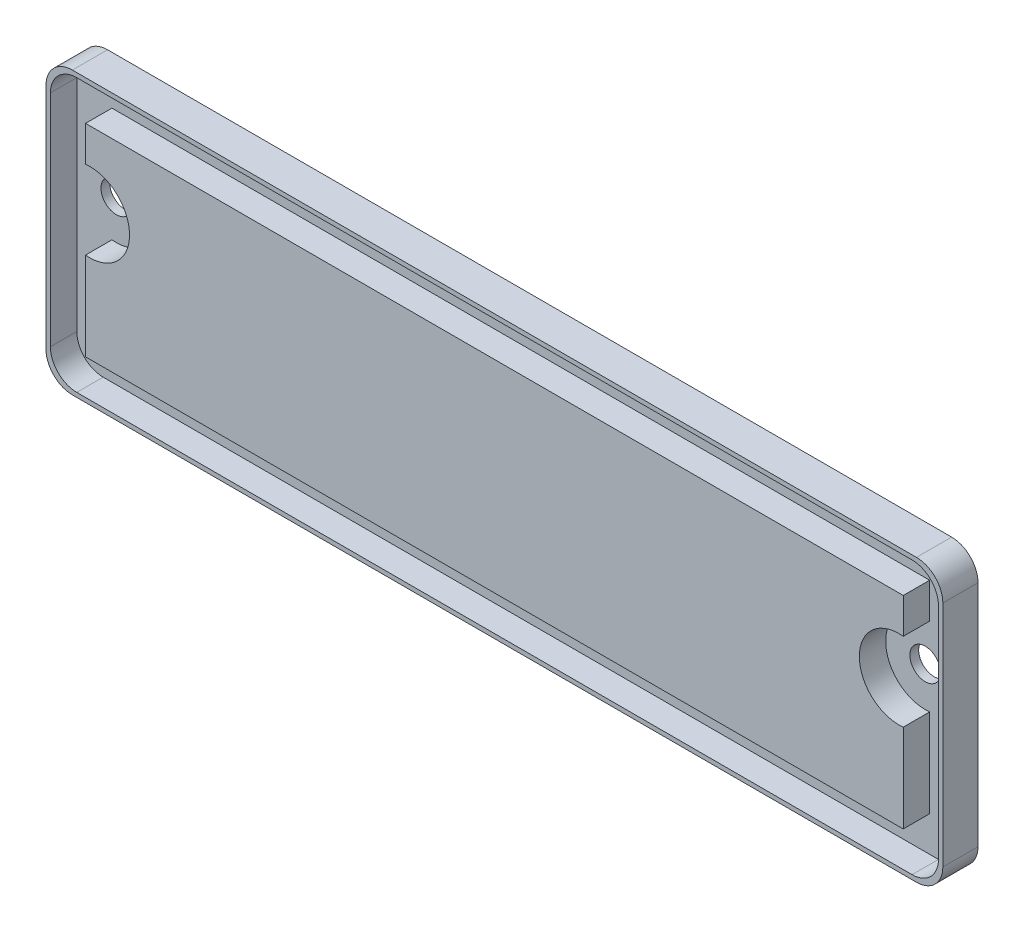
ISO-10303-21;
HEADER;
FILE_DESCRIPTION(('STEP AP214'),'2;1');
FILE_NAME('part.step','',(''),(''),'','','');
FILE_SCHEMA(('AUTOMOTIVE_DESIGN { 1 0 10303 214 1 1 1 1 }'));
ENDSEC;
DATA;
#1=APPLICATION_CONTEXT('core data for automotive mechanical design processes');
#2=APPLICATION_PROTOCOL_DEFINITION('international standard','automotive_design',2000,#1);
#3=PRODUCT_CONTEXT('',#1,'mechanical');
#4=PRODUCT('Part','Part','',(#3));
#5=PRODUCT_RELATED_PRODUCT_CATEGORY('part','',(#4));
#6=PRODUCT_DEFINITION_FORMATION('','',#4);
#7=PRODUCT_DEFINITION_CONTEXT('part definition',#1,'design');
#8=PRODUCT_DEFINITION('design','',#6,#7);
#9=PRODUCT_DEFINITION_SHAPE('','',#8);
#10=(LENGTH_UNIT() NAMED_UNIT(*) SI_UNIT(.MILLI.,.METRE.));
#11=(NAMED_UNIT(*) PLANE_ANGLE_UNIT() SI_UNIT($,.RADIAN.));
#12=(NAMED_UNIT(*) SI_UNIT($,.STERADIAN.) SOLID_ANGLE_UNIT());
#13=UNCERTAINTY_MEASURE_WITH_UNIT(LENGTH_MEASURE(1.E-05),#10,'distance_accuracy_value','');
#14=(GEOMETRIC_REPRESENTATION_CONTEXT(3) GLOBAL_UNCERTAINTY_ASSIGNED_CONTEXT((#13)) GLOBAL_UNIT_ASSIGNED_CONTEXT((#10,
#11,#12)) REPRESENTATION_CONTEXT('',''));
#15=CARTESIAN_POINT('',(0.,0.,0.));
#16=DIRECTION('',(0.,0.,1.));
#17=DIRECTION('',(1.,0.,0.));
#18=AXIS2_PLACEMENT_3D('',#15,#16,#17);
#19=CARTESIAN_POINT('',(0.,0.,1.));
#20=DIRECTION('',(0.,0.,1.));
#21=DIRECTION('',(1.,0.,0.));
#22=AXIS2_PLACEMENT_3D('',#19,#20,#21);
#23=PLANE('',#22);
#24=CARTESIAN_POINT('',(-5.,19.,1.));
#25=DIRECTION('',(0.,0.,1.));
#26=DIRECTION('',(1.,0.,0.));
#27=AXIS2_PLACEMENT_3D('',#24,#25,#26);
#28=CIRCLE('',#27,1.75000000000001);
#29=CARTESIAN_POINT('',(-3.24999999999999,19.,1.));
#30=VERTEX_POINT('',#29);
#31=EDGE_CURVE('E471',#30,#30,#28,.T.);
#32=ORIENTED_EDGE('',*,*,#31,.F.);
#33=EDGE_LOOP('',(#32));
#34=FACE_BOUND('',#33,.T.);
#35=CARTESIAN_POINT('',(-97.,19.,1.));
#36=DIRECTION('',(0.,0.,1.));
#37=DIRECTION('',(1.,0.,0.));
#38=AXIS2_PLACEMENT_3D('',#35,#36,#37);
#39=CIRCLE('',#38,1.75);
#40=CARTESIAN_POINT('',(-95.25,19.,1.));
#41=VERTEX_POINT('',#40);
#42=EDGE_CURVE('E465',#41,#41,#39,.T.);
#43=ORIENTED_EDGE('',*,*,#42,.F.);
#44=EDGE_LOOP('',(#43));
#45=FACE_BOUND('',#44,.T.);
#46=CARTESIAN_POINT('',(-5.,19.,1.));
#47=DIRECTION('',(0.,0.,1.));
#48=DIRECTION('',(1.,0.,0.));
#49=AXIS2_PLACEMENT_3D('',#46,#47,#48);
#50=CIRCLE('',#49,4.5);
#51=CARTESIAN_POINT('',(-4.5,23.4721359549995,1.));
#52=VERTEX_POINT('',#51);
#53=CARTESIAN_POINT('',(-4.5,14.5278640450004,1.));
#54=VERTEX_POINT('',#53);
#55=EDGE_CURVE('E243',#52,#54,#50,.T.);
#56=ORIENTED_EDGE('',*,*,#55,.T.);
#57=DIRECTION('',(0.,-1.,0.));
#58=VECTOR('',#57,1.);
#59=CARTESIAN_POINT('',(-4.5,0.,1.));
#60=LINE('',#59,#58);
#61=CARTESIAN_POINT('',(-4.5,4.49999999999997,1.));
#62=VERTEX_POINT('',#61);
#63=EDGE_CURVE('E261',#54,#62,#60,.T.);
#64=ORIENTED_EDGE('',*,*,#63,.T.);
#65=DIRECTION('',(1.,0.,0.));
#66=VECTOR('',#65,1.);
#67=CARTESIAN_POINT('',(0.,4.49999999999997,1.));
#68=LINE('',#67,#66);
#69=CARTESIAN_POINT('',(-97.5,4.49999999999997,1.));
#70=VERTEX_POINT('',#69);
#71=EDGE_CURVE('E263',#70,#62,#68,.T.);
#72=ORIENTED_EDGE('',*,*,#71,.F.);
#73=DIRECTION('',(0.,-1.,0.));
#74=VECTOR('',#73,1.);
#75=CARTESIAN_POINT('',(-97.5,0.,1.));
#76=LINE('',#75,#74);
#77=CARTESIAN_POINT('',(-97.5,14.5278640450004,1.));
#78=VERTEX_POINT('',#77);
#79=EDGE_CURVE('E292',#78,#70,#76,.T.);
#80=ORIENTED_EDGE('',*,*,#79,.F.);
#81=CARTESIAN_POINT('',(-97.,19.,1.));
#82=DIRECTION('',(0.,0.,1.));
#83=DIRECTION('',(1.,0.,0.));
#84=AXIS2_PLACEMENT_3D('',#81,#82,#83);
#85=CIRCLE('',#84,4.5);
#86=CARTESIAN_POINT('',(-97.5,23.4721359549996,1.));
#87=VERTEX_POINT('',#86);
#88=EDGE_CURVE('E289',#87,#78,#85,.F.);
#89=ORIENTED_EDGE('',*,*,#88,.F.);
#90=DIRECTION('',(0.,-1.,0.));
#91=VECTOR('',#90,1.);
#92=CARTESIAN_POINT('',(-97.5,0.,1.));
#93=LINE('',#92,#91);
#94=CARTESIAN_POINT('',(-97.5,27.5,1.));
#95=VERTEX_POINT('',#94);
#96=EDGE_CURVE('E286',#95,#87,#93,.T.);
#97=ORIENTED_EDGE('',*,*,#96,.F.);
#98=DIRECTION('',(1.,0.,0.));
#99=VECTOR('',#98,1.);
#100=CARTESIAN_POINT('',(0.,27.5,1.));
#101=LINE('',#100,#99);
#102=CARTESIAN_POINT('',(-4.5,27.5,1.));
#103=VERTEX_POINT('',#102);
#104=EDGE_CURVE('E284',#95,#103,#101,.T.);
#105=ORIENTED_EDGE('',*,*,#104,.T.);
#106=DIRECTION('',(0.,1.,0.));
#107=VECTOR('',#106,1.);
#108=CARTESIAN_POINT('',(-4.5,0.,1.));
#109=LINE('',#108,#107);
#110=EDGE_CURVE('E281',#52,#103,#109,.T.);
#111=ORIENTED_EDGE('',*,*,#110,.F.);
#112=EDGE_LOOP('',(#56,#64,#72,#80,#89,#97,#105,#111));
#113=FACE_BOUND('',#112,.T.);
#114=DIRECTION('',(0.,-1.,0.));
#115=VECTOR('',#114,1.);
#116=CARTESIAN_POINT('',(-0.5,0.,1.));
#117=LINE('',#116,#115);
#118=CARTESIAN_POINT('',(-0.5,28.5,1.));
#119=VERTEX_POINT('',#118);
#120=CARTESIAN_POINT('',(-0.5,3.5,1.));
#121=VERTEX_POINT('',#120);
#122=EDGE_CURVE('E455',#119,#121,#117,.T.);
#123=ORIENTED_EDGE('',*,*,#122,.F.);
#124=CARTESIAN_POINT('',(-3.5,28.5,1.));
#125=DIRECTION('',(0.,0.,1.));
#126=DIRECTION('',(1.,0.,0.));
#127=AXIS2_PLACEMENT_3D('',#124,#125,#126);
#128=CIRCLE('',#127,3.);
#129=CARTESIAN_POINT('',(-3.5,31.5,1.));
#130=VERTEX_POINT('',#129);
#131=EDGE_CURVE('E364',#119,#130,#128,.T.);
#132=ORIENTED_EDGE('',*,*,#131,.T.);
#133=DIRECTION('',(1.,0.,0.));
#134=VECTOR('',#133,1.);
#135=CARTESIAN_POINT('',(0.,31.5,1.));
#136=LINE('',#135,#134);
#137=CARTESIAN_POINT('',(-98.5,31.5,1.));
#138=VERTEX_POINT('',#137);
#139=EDGE_CURVE('E452',#138,#130,#136,.T.);
#140=ORIENTED_EDGE('',*,*,#139,.F.);
#141=CARTESIAN_POINT('',(-98.5,28.5,1.));
#142=DIRECTION('',(0.,0.,1.));
#143=DIRECTION('',(1.,0.,0.));
#144=AXIS2_PLACEMENT_3D('',#141,#142,#143);
#145=CIRCLE('',#144,3.);
#146=CARTESIAN_POINT('',(-101.5,28.5,1.));
#147=VERTEX_POINT('',#146);
#148=EDGE_CURVE('E358',#138,#147,#145,.T.);
#149=ORIENTED_EDGE('',*,*,#148,.T.);
#150=DIRECTION('',(0.,-1.,0.));
#151=VECTOR('',#150,1.);
#152=CARTESIAN_POINT('',(-101.5,0.,1.));
#153=LINE('',#152,#151);
#154=CARTESIAN_POINT('',(-101.5,3.5,1.));
#155=VERTEX_POINT('',#154);
#156=EDGE_CURVE('E266',#147,#155,#153,.T.);
#157=ORIENTED_EDGE('',*,*,#156,.T.);
#158=CARTESIAN_POINT('',(-98.5,3.5,1.));
#159=DIRECTION('',(0.,0.,1.));
#160=DIRECTION('',(1.,0.,0.));
#161=AXIS2_PLACEMENT_3D('',#158,#159,#160);
#162=CIRCLE('',#161,3.);
#163=CARTESIAN_POINT('',(-98.5,0.5,1.));
#164=VERTEX_POINT('',#163);
#165=EDGE_CURVE('E360',#155,#164,#162,.T.);
#166=ORIENTED_EDGE('',*,*,#165,.T.);
#167=DIRECTION('',(1.,0.,0.));
#168=VECTOR('',#167,1.);
#169=CARTESIAN_POINT('',(0.,0.5,1.));
#170=LINE('',#169,#168);
#171=CARTESIAN_POINT('',(-3.5,0.5,1.));
#172=VERTEX_POINT('',#171);
#173=EDGE_CURVE('E458',#164,#172,#170,.T.);
#174=ORIENTED_EDGE('',*,*,#173,.T.);
#175=CARTESIAN_POINT('',(-3.5,3.5,1.));
#176=DIRECTION('',(0.,0.,1.));
#177=DIRECTION('',(1.,0.,0.));
#178=AXIS2_PLACEMENT_3D('',#175,#176,#177);
#179=CIRCLE('',#178,3.);
#180=EDGE_CURVE('E362',#172,#121,#179,.T.);
#181=ORIENTED_EDGE('',*,*,#180,.T.);
#182=EDGE_LOOP('',(#123,#132,#140,#149,#157,#166,#174,#181));
#183=FACE_BOUND('',#182,.T.);
#184=ADVANCED_FACE('F73',(#34,#45,#113,#183),#23,.T.);
#185=CARTESIAN_POINT('',(-5.,19.,4.));
#186=DIRECTION('',(0.,0.,-1.));
#187=DIRECTION('',(-1.,0.,0.));
#188=AXIS2_PLACEMENT_3D('',#185,#186,#187);
#189=CYLINDRICAL_SURFACE('',#188,4.5);
#190=ORIENTED_EDGE('',*,*,#55,.F.);
#191=DIRECTION('',(0.,0.,-1.));
#192=VECTOR('',#191,1.);
#193=CARTESIAN_POINT('',(-4.5,23.4721359549995,4.));
#194=LINE('',#193,#192);
#195=CARTESIAN_POINT('',(-4.5,23.4721359549995,4.));
#196=VERTEX_POINT('',#195);
#197=EDGE_CURVE('E236',#196,#52,#194,.T.);
#198=ORIENTED_EDGE('',*,*,#197,.F.);
#199=CARTESIAN_POINT('',(-5.,19.,4.));
#200=DIRECTION('',(0.,0.,1.));
#201=DIRECTION('',(1.,0.,0.));
#202=AXIS2_PLACEMENT_3D('',#199,#200,#201);
#203=CIRCLE('',#202,4.5);
#204=CARTESIAN_POINT('',(-4.5,14.5278640450004,4.));
#205=VERTEX_POINT('',#204);
#206=EDGE_CURVE('E241',#196,#205,#203,.T.);
#207=ORIENTED_EDGE('',*,*,#206,.T.);
#208=DIRECTION('',(0.,0.,-1.));
#209=VECTOR('',#208,1.);
#210=CARTESIAN_POINT('',(-4.5,14.5278640450004,4.));
#211=LINE('',#210,#209);
#212=EDGE_CURVE('E279',#205,#54,#211,.T.);
#213=ORIENTED_EDGE('',*,*,#212,.T.);
#214=EDGE_LOOP('',(#190,#198,#207,#213));
#215=FACE_BOUND('',#214,.T.);
#216=ADVANCED_FACE('F238',(#215),#189,.F.);
#217=CARTESIAN_POINT('',(-4.5,0.,4.));
#218=DIRECTION('',(-1.,0.,0.));
#219=DIRECTION('',(0.,0.,1.));
#220=AXIS2_PLACEMENT_3D('',#217,#218,#219);
#221=PLANE('',#220);
#222=ORIENTED_EDGE('',*,*,#110,.T.);
#223=DIRECTION('',(0.,0.,-1.));
#224=VECTOR('',#223,1.);
#225=CARTESIAN_POINT('',(-4.5,27.5,4.));
#226=LINE('',#225,#224);
#227=CARTESIAN_POINT('',(-4.5,27.5,4.));
#228=VERTEX_POINT('',#227);
#229=EDGE_CURVE('E247',#228,#103,#226,.T.);
#230=ORIENTED_EDGE('',*,*,#229,.F.);
#231=DIRECTION('',(0.,1.,0.));
#232=VECTOR('',#231,1.);
#233=CARTESIAN_POINT('',(-4.5,0.,4.));
#234=LINE('',#233,#232);
#235=EDGE_CURVE('E250',#196,#228,#234,.T.);
#236=ORIENTED_EDGE('',*,*,#235,.F.);
#237=ORIENTED_EDGE('',*,*,#197,.T.);
#238=EDGE_LOOP('',(#222,#230,#236,#237));
#239=FACE_BOUND('',#238,.T.);
#240=ADVANCED_FACE('F251',(#239),#221,.F.);
#241=CARTESIAN_POINT('',(0.,27.5,4.));
#242=DIRECTION('',(0.,1.,0.));
#243=DIRECTION('',(0.,0.,1.));
#244=AXIS2_PLACEMENT_3D('',#241,#242,#243);
#245=PLANE('',#244);
#246=ORIENTED_EDGE('',*,*,#104,.F.);
#247=DIRECTION('',(0.,0.,-1.));
#248=VECTOR('',#247,1.);
#249=CARTESIAN_POINT('',(-97.5,27.5,4.));
#250=LINE('',#249,#248);
#251=CARTESIAN_POINT('',(-97.5,27.5,4.));
#252=VERTEX_POINT('',#251);
#253=EDGE_CURVE('E310',#252,#95,#250,.T.);
#254=ORIENTED_EDGE('',*,*,#253,.F.);
#255=DIRECTION('',(1.,0.,0.));
#256=VECTOR('',#255,1.);
#257=CARTESIAN_POINT('',(0.,27.5,4.));
#258=LINE('',#257,#256);
#259=EDGE_CURVE('E256',#252,#228,#258,.T.);
#260=ORIENTED_EDGE('',*,*,#259,.T.);
#261=ORIENTED_EDGE('',*,*,#229,.T.);
#262=EDGE_LOOP('',(#246,#254,#260,#261));
#263=FACE_BOUND('',#262,.T.);
#264=ADVANCED_FACE('F743',(#263),#245,.T.);
#265=CARTESIAN_POINT('',(-97.5,0.,4.));
#266=DIRECTION('',(1.,0.,0.));
#267=DIRECTION('',(0.,0.,-1.));
#268=AXIS2_PLACEMENT_3D('',#265,#266,#267);
#269=PLANE('',#268);
#270=ORIENTED_EDGE('',*,*,#96,.T.);
#271=DIRECTION('',(0.,0.,-1.));
#272=VECTOR('',#271,1.);
#273=CARTESIAN_POINT('',(-97.5,23.4721359549996,4.));
#274=LINE('',#273,#272);
#275=CARTESIAN_POINT('',(-97.5,23.4721359549996,4.));
#276=VERTEX_POINT('',#275);
#277=EDGE_CURVE('E307',#276,#87,#274,.T.);
#278=ORIENTED_EDGE('',*,*,#277,.F.);
#279=DIRECTION('',(0.,-1.,0.));
#280=VECTOR('',#279,1.);
#281=CARTESIAN_POINT('',(-97.5,0.,4.));
#282=LINE('',#281,#280);
#283=EDGE_CURVE('E270',#252,#276,#282,.T.);
#284=ORIENTED_EDGE('',*,*,#283,.F.);
#285=ORIENTED_EDGE('',*,*,#253,.T.);
#286=EDGE_LOOP('',(#270,#278,#284,#285));
#287=FACE_BOUND('',#286,.T.);
#288=ADVANCED_FACE('F733',(#287),#269,.F.);
#289=CARTESIAN_POINT('',(-97.,19.,4.));
#290=DIRECTION('',(0.,0.,-1.));
#291=DIRECTION('',(-1.,0.,0.));
#292=AXIS2_PLACEMENT_3D('',#289,#290,#291);
#293=CYLINDRICAL_SURFACE('',#292,4.5);
#294=ORIENTED_EDGE('',*,*,#88,.T.);
#295=DIRECTION('',(0.,0.,-1.));
#296=VECTOR('',#295,1.);
#297=CARTESIAN_POINT('',(-97.5,14.5278640450004,4.));
#298=LINE('',#297,#296);
#299=CARTESIAN_POINT('',(-97.5,14.5278640450004,4.));
#300=VERTEX_POINT('',#299);
#301=EDGE_CURVE('E304',#300,#78,#298,.T.);
#302=ORIENTED_EDGE('',*,*,#301,.F.);
#303=CARTESIAN_POINT('',(-97.,19.,4.));
#304=DIRECTION('',(0.,0.,1.));
#305=DIRECTION('',(1.,0.,0.));
#306=AXIS2_PLACEMENT_3D('',#303,#304,#305);
#307=CIRCLE('',#306,4.5);
#308=EDGE_CURVE('E272',#276,#300,#307,.F.);
#309=ORIENTED_EDGE('',*,*,#308,.F.);
#310=ORIENTED_EDGE('',*,*,#277,.T.);
#311=EDGE_LOOP('',(#294,#302,#309,#310));
#312=FACE_BOUND('',#311,.T.);
#313=ADVANCED_FACE('F723',(#312),#293,.F.);
#314=CARTESIAN_POINT('',(-97.5,0.,4.));
#315=DIRECTION('',(1.,0.,0.));
#316=DIRECTION('',(0.,0.,-1.));
#317=AXIS2_PLACEMENT_3D('',#314,#315,#316);
#318=PLANE('',#317);
#319=ORIENTED_EDGE('',*,*,#79,.T.);
#320=DIRECTION('',(0.,0.,-1.));
#321=VECTOR('',#320,1.);
#322=CARTESIAN_POINT('',(-97.5,4.49999999999997,4.));
#323=LINE('',#322,#321);
#324=CARTESIAN_POINT('',(-97.5,4.49999999999997,4.));
#325=VERTEX_POINT('',#324);
#326=EDGE_CURVE('E301',#325,#70,#323,.T.);
#327=ORIENTED_EDGE('',*,*,#326,.F.);
#328=DIRECTION('',(0.,-1.,0.));
#329=VECTOR('',#328,1.);
#330=CARTESIAN_POINT('',(-97.5,0.,4.));
#331=LINE('',#330,#329);
#332=EDGE_CURVE('E274',#300,#325,#331,.T.);
#333=ORIENTED_EDGE('',*,*,#332,.F.);
#334=ORIENTED_EDGE('',*,*,#301,.T.);
#335=EDGE_LOOP('',(#319,#327,#333,#334));
#336=FACE_BOUND('',#335,.T.);
#337=ADVANCED_FACE('F713',(#336),#318,.F.);
#338=CARTESIAN_POINT('',(0.,4.49999999999997,4.));
#339=DIRECTION('',(0.,1.,0.));
#340=DIRECTION('',(0.,0.,1.));
#341=AXIS2_PLACEMENT_3D('',#338,#339,#340);
#342=PLANE('',#341);
#343=ORIENTED_EDGE('',*,*,#71,.T.);
#344=DIRECTION('',(0.,0.,-1.));
#345=VECTOR('',#344,1.);
#346=CARTESIAN_POINT('',(-4.5,4.49999999999997,4.));
#347=LINE('',#346,#345);
#348=CARTESIAN_POINT('',(-4.5,4.49999999999997,4.));
#349=VERTEX_POINT('',#348);
#350=EDGE_CURVE('E298',#349,#62,#347,.T.);
#351=ORIENTED_EDGE('',*,*,#350,.F.);
#352=DIRECTION('',(1.,0.,0.));
#353=VECTOR('',#352,1.);
#354=CARTESIAN_POINT('',(0.,4.49999999999997,4.));
#355=LINE('',#354,#353);
#356=EDGE_CURVE('E276',#325,#349,#355,.T.);
#357=ORIENTED_EDGE('',*,*,#356,.F.);
#358=ORIENTED_EDGE('',*,*,#326,.T.);
#359=EDGE_LOOP('',(#343,#351,#357,#358));
#360=FACE_BOUND('',#359,.T.);
#361=ADVANCED_FACE('F703',(#360),#342,.F.);
#362=CARTESIAN_POINT('',(-4.5,0.,4.));
#363=DIRECTION('',(1.,0.,0.));
#364=DIRECTION('',(0.,0.,-1.));
#365=AXIS2_PLACEMENT_3D('',#362,#363,#364);
#366=PLANE('',#365);
#367=ORIENTED_EDGE('',*,*,#63,.F.);
#368=ORIENTED_EDGE('',*,*,#212,.F.);
#369=DIRECTION('',(0.,-1.,0.));
#370=VECTOR('',#369,1.);
#371=CARTESIAN_POINT('',(-4.5,0.,4.));
#372=LINE('',#371,#370);
#373=EDGE_CURVE('E260',#205,#349,#372,.T.);
#374=ORIENTED_EDGE('',*,*,#373,.T.);
#375=ORIENTED_EDGE('',*,*,#350,.T.);
#376=EDGE_LOOP('',(#367,#368,#374,#375));
#377=FACE_BOUND('',#376,.T.);
#378=ADVANCED_FACE('F694',(#377),#366,.T.);
#379=CARTESIAN_POINT('',(0.,0.,4.));
#380=DIRECTION('',(0.,0.,1.));
#381=DIRECTION('',(1.,0.,0.));
#382=AXIS2_PLACEMENT_3D('',#379,#380,#381);
#383=PLANE('',#382);
#384=ORIENTED_EDGE('',*,*,#206,.F.);
#385=ORIENTED_EDGE('',*,*,#235,.T.);
#386=ORIENTED_EDGE('',*,*,#259,.F.);
#387=ORIENTED_EDGE('',*,*,#283,.T.);
#388=ORIENTED_EDGE('',*,*,#308,.T.);
#389=ORIENTED_EDGE('',*,*,#332,.T.);
#390=ORIENTED_EDGE('',*,*,#356,.T.);
#391=ORIENTED_EDGE('',*,*,#373,.F.);
#392=EDGE_LOOP('',(#384,#385,#386,#387,#388,#389,#390,#391));
#393=FACE_BOUND('',#392,.T.);
#394=ADVANCED_FACE('F258',(#393),#383,.T.);
#395=CARTESIAN_POINT('',(0.,31.5,4.));
#396=DIRECTION('',(0.,1.,0.));
#397=DIRECTION('',(0.,0.,1.));
#398=AXIS2_PLACEMENT_3D('',#395,#396,#397);
#399=PLANE('',#398);
#400=ORIENTED_EDGE('',*,*,#139,.T.);
#401=DIRECTION('',(0.,0.,-1.));
#402=VECTOR('',#401,1.);
#403=CARTESIAN_POINT('',(-3.5,31.5,4.));
#404=LINE('',#403,#402);
#405=CARTESIAN_POINT('',(-3.5,31.5,4.));
#406=VERTEX_POINT('',#405);
#407=EDGE_CURVE('E369',#130,#406,#404,.F.);
#408=ORIENTED_EDGE('',*,*,#407,.T.);
#409=DIRECTION('',(1.,0.,0.));
#410=VECTOR('',#409,1.);
#411=CARTESIAN_POINT('',(0.,31.5,4.));
#412=LINE('',#411,#410);
#413=CARTESIAN_POINT('',(-98.5,31.5,4.));
#414=VERTEX_POINT('',#413);
#415=EDGE_CURVE('E439',#414,#406,#412,.T.);
#416=ORIENTED_EDGE('',*,*,#415,.F.);
#417=DIRECTION('',(0.,0.,-1.));
#418=VECTOR('',#417,1.);
#419=CARTESIAN_POINT('',(-98.5,31.5,4.));
#420=LINE('',#419,#418);
#421=EDGE_CURVE('E366',#414,#138,#420,.T.);
#422=ORIENTED_EDGE('',*,*,#421,.T.);
#423=EDGE_LOOP('',(#400,#408,#416,#422));
#424=FACE_BOUND('',#423,.T.);
#425=ADVANCED_FACE('F514',(#424),#399,.F.);
#426=CARTESIAN_POINT('',(-0.5,0.,4.));
#427=DIRECTION('',(1.,0.,0.));
#428=DIRECTION('',(0.,1.,0.));
#429=AXIS2_PLACEMENT_3D('',#426,#427,#428);
#430=PLANE('',#429);
#431=DIRECTION('',(0.,-1.,0.));
#432=VECTOR('',#431,1.);
#433=CARTESIAN_POINT('',(-0.5,0.,4.));
#434=LINE('',#433,#432);
#435=CARTESIAN_POINT('',(-0.5,28.5,4.));
#436=VERTEX_POINT('',#435);
#437=CARTESIAN_POINT('',(-0.5,3.5,4.));
#438=VERTEX_POINT('',#437);
#439=EDGE_CURVE('E442',#436,#438,#434,.T.);
#440=ORIENTED_EDGE('',*,*,#439,.F.);
#441=DIRECTION('',(0.,0.,-1.));
#442=VECTOR('',#441,1.);
#443=CARTESIAN_POINT('',(-0.5,28.5,1.));
#444=LINE('',#443,#442);
#445=EDGE_CURVE('E355',#436,#119,#444,.T.);
#446=ORIENTED_EDGE('',*,*,#445,.T.);
#447=ORIENTED_EDGE('',*,*,#122,.T.);
#448=DIRECTION('',(0.,0.,-1.));
#449=VECTOR('',#448,1.);
#450=CARTESIAN_POINT('',(-0.5,3.5,4.));
#451=LINE('',#450,#449);
#452=EDGE_CURVE('E353',#121,#438,#451,.F.);
#453=ORIENTED_EDGE('',*,*,#452,.T.);
#454=EDGE_LOOP('',(#440,#446,#447,#453));
#455=FACE_BOUND('',#454,.T.);
#456=ADVANCED_FACE('F496',(#455),#430,.F.);
#457=CARTESIAN_POINT('',(0.,0.5,4.));
#458=DIRECTION('',(0.,1.,0.));
#459=DIRECTION('',(0.,0.,1.));
#460=AXIS2_PLACEMENT_3D('',#457,#458,#459);
#461=PLANE('',#460);
#462=DIRECTION('',(1.,0.,0.));
#463=VECTOR('',#462,1.);
#464=CARTESIAN_POINT('',(0.,0.5,4.));
#465=LINE('',#464,#463);
#466=CARTESIAN_POINT('',(-98.5,0.5,4.));
#467=VERTEX_POINT('',#466);
#468=CARTESIAN_POINT('',(-3.5,0.5,4.));
#469=VERTEX_POINT('',#468);
#470=EDGE_CURVE('E448',#467,#469,#465,.T.);
#471=ORIENTED_EDGE('',*,*,#470,.T.);
#472=DIRECTION('',(0.,0.,-1.));
#473=VECTOR('',#472,1.);
#474=CARTESIAN_POINT('',(-3.5,0.5,4.));
#475=LINE('',#474,#473);
#476=EDGE_CURVE('E373',#469,#172,#475,.T.);
#477=ORIENTED_EDGE('',*,*,#476,.T.);
#478=ORIENTED_EDGE('',*,*,#173,.F.);
#479=DIRECTION('',(0.,0.,-1.));
#480=VECTOR('',#479,1.);
#481=CARTESIAN_POINT('',(-98.5,0.5,4.));
#482=LINE('',#481,#480);
#483=EDGE_CURVE('E371',#164,#467,#482,.F.);
#484=ORIENTED_EDGE('',*,*,#483,.T.);
#485=EDGE_LOOP('',(#471,#477,#478,#484));
#486=FACE_BOUND('',#485,.T.);
#487=ADVANCED_FACE('F503',(#486),#461,.T.);
#488=CARTESIAN_POINT('',(-101.5,0.,4.));
#489=DIRECTION('',(1.,0.,0.));
#490=DIRECTION('',(0.,0.,-1.));
#491=AXIS2_PLACEMENT_3D('',#488,#489,#490);
#492=PLANE('',#491);
#493=DIRECTION('',(0.,-1.,0.));
#494=VECTOR('',#493,1.);
#495=CARTESIAN_POINT('',(-101.5,0.,4.));
#496=LINE('',#495,#494);
#497=CARTESIAN_POINT('',(-101.5,28.5,4.));
#498=VERTEX_POINT('',#497);
#499=CARTESIAN_POINT('',(-101.5,3.5,4.));
#500=VERTEX_POINT('',#499);
#501=EDGE_CURVE('E282',#498,#500,#496,.T.);
#502=ORIENTED_EDGE('',*,*,#501,.T.);
#503=DIRECTION('',(0.,0.,-1.));
#504=VECTOR('',#503,1.);
#505=CARTESIAN_POINT('',(-101.5,3.5,1.));
#506=LINE('',#505,#504);
#507=EDGE_CURVE('E377',#500,#155,#506,.T.);
#508=ORIENTED_EDGE('',*,*,#507,.T.);
#509=ORIENTED_EDGE('',*,*,#156,.F.);
#510=DIRECTION('',(0.,0.,-1.));
#511=VECTOR('',#510,1.);
#512=CARTESIAN_POINT('',(-101.5,28.5,4.));
#513=LINE('',#512,#511);
#514=EDGE_CURVE('E95',#147,#498,#513,.F.);
#515=ORIENTED_EDGE('',*,*,#514,.T.);
#516=EDGE_LOOP('',(#502,#508,#509,#515));
#517=FACE_BOUND('',#516,.T.);
#518=ADVANCED_FACE('F508',(#517),#492,.T.);
#519=CARTESIAN_POINT('',(0.,0.,4.));
#520=DIRECTION('',(0.,0.,1.));
#521=DIRECTION('',(1.,0.,0.));
#522=AXIS2_PLACEMENT_3D('',#519,#520,#521);
#523=PLANE('',#522);
#524=DIRECTION('',(1.,0.,0.));
#525=VECTOR('',#524,1.);
#526=CARTESIAN_POINT('',(0.,0.,4.));
#527=LINE('',#526,#525);
#528=CARTESIAN_POINT('',(-99.,0.,4.));
#529=VERTEX_POINT('',#528);
#530=CARTESIAN_POINT('',(-3.,0.,4.));
#531=VERTEX_POINT('',#530);
#532=EDGE_CURVE('E426',#529,#531,#527,.T.);
#533=ORIENTED_EDGE('',*,*,#532,.T.);
#534=CARTESIAN_POINT('',(-3.,3.,4.));
#535=DIRECTION('',(0.,0.,1.));
#536=DIRECTION('',(1.,0.,0.));
#537=AXIS2_PLACEMENT_3D('',#534,#535,#536);
#538=CIRCLE('',#537,3.);
#539=CARTESIAN_POINT('',(0.,3.,4.));
#540=VERTEX_POINT('',#539);
#541=EDGE_CURVE('E12',#531,#540,#538,.T.);
#542=ORIENTED_EDGE('',*,*,#541,.T.);
#543=DIRECTION('',(0.,1.,0.));
#544=VECTOR('',#543,1.);
#545=CARTESIAN_POINT('',(0.,0.,4.));
#546=LINE('',#545,#544);
#547=CARTESIAN_POINT('',(0.,29.,4.));
#548=VERTEX_POINT('',#547);
#549=EDGE_CURVE('E400',#540,#548,#546,.T.);
#550=ORIENTED_EDGE('',*,*,#549,.T.);
#551=CARTESIAN_POINT('',(-3.,29.,4.));
#552=DIRECTION('',(0.,0.,1.));
#553=DIRECTION('',(1.,0.,0.));
#554=AXIS2_PLACEMENT_3D('',#551,#552,#553);
#555=CIRCLE('',#554,3.);
#556=CARTESIAN_POINT('',(-3.,32.,4.));
#557=VERTEX_POINT('',#556);
#558=EDGE_CURVE('E81',#548,#557,#555,.T.);
#559=ORIENTED_EDGE('',*,*,#558,.T.);
#560=DIRECTION('',(-1.,0.,0.));
#561=VECTOR('',#560,1.);
#562=CARTESIAN_POINT('',(0.,32.,4.));
#563=LINE('',#562,#561);
#564=CARTESIAN_POINT('',(-99.,32.,4.));
#565=VERTEX_POINT('',#564);
#566=EDGE_CURVE('E397',#557,#565,#563,.T.);
#567=ORIENTED_EDGE('',*,*,#566,.T.);
#568=CARTESIAN_POINT('',(-99.,29.,4.));
#569=DIRECTION('',(0.,0.,1.));
#570=DIRECTION('',(1.,0.,0.));
#571=AXIS2_PLACEMENT_3D('',#568,#569,#570);
#572=CIRCLE('',#571,3.);
#573=CARTESIAN_POINT('',(-102.,29.,4.));
#574=VERTEX_POINT('',#573);
#575=EDGE_CURVE('E389',#565,#574,#572,.T.);
#576=ORIENTED_EDGE('',*,*,#575,.T.);
#577=DIRECTION('',(0.,-1.,0.));
#578=VECTOR('',#577,1.);
#579=CARTESIAN_POINT('',(-102.,0.,4.));
#580=LINE('',#579,#578);
#581=CARTESIAN_POINT('',(-102.,2.99999999999999,4.));
#582=VERTEX_POINT('',#581);
#583=EDGE_CURVE('E408',#574,#582,#580,.T.);
#584=ORIENTED_EDGE('',*,*,#583,.T.);
#585=CARTESIAN_POINT('',(-99.,2.99999999999999,4.));
#586=DIRECTION('',(0.,0.,1.));
#587=DIRECTION('',(1.,0.,0.));
#588=AXIS2_PLACEMENT_3D('',#585,#586,#587);
#589=CIRCLE('',#588,3.);
#590=EDGE_CURVE('E387',#582,#529,#589,.T.);
#591=ORIENTED_EDGE('',*,*,#590,.T.);
#592=EDGE_LOOP('',(#533,#542,#550,#559,#567,#576,#584,#591));
#593=FACE_BOUND('',#592,.T.);
#594=ORIENTED_EDGE('',*,*,#501,.F.);
#595=CARTESIAN_POINT('',(-98.5,28.5,4.));
#596=DIRECTION('',(0.,0.,1.));
#597=DIRECTION('',(1.,0.,0.));
#598=AXIS2_PLACEMENT_3D('',#595,#596,#597);
#599=CIRCLE('',#598,3.);
#600=EDGE_CURVE('E385',#498,#414,#599,.F.);
#601=ORIENTED_EDGE('',*,*,#600,.T.);
#602=ORIENTED_EDGE('',*,*,#415,.T.);
#603=CARTESIAN_POINT('',(-3.5,28.5,4.));
#604=DIRECTION('',(0.,0.,1.));
#605=DIRECTION('',(1.,0.,0.));
#606=AXIS2_PLACEMENT_3D('',#603,#604,#605);
#607=CIRCLE('',#606,3.);
#608=EDGE_CURVE('E380',#406,#436,#607,.F.);
#609=ORIENTED_EDGE('',*,*,#608,.T.);
#610=ORIENTED_EDGE('',*,*,#439,.T.);
#611=CARTESIAN_POINT('',(-3.5,3.5,4.));
#612=DIRECTION('',(0.,0.,1.));
#613=DIRECTION('',(1.,0.,0.));
#614=AXIS2_PLACEMENT_3D('',#611,#612,#613);
#615=CIRCLE('',#614,3.);
#616=EDGE_CURVE('E382',#438,#469,#615,.F.);
#617=ORIENTED_EDGE('',*,*,#616,.T.);
#618=ORIENTED_EDGE('',*,*,#470,.F.);
#619=CARTESIAN_POINT('',(-98.5,3.5,4.));
#620=DIRECTION('',(0.,0.,1.));
#621=DIRECTION('',(1.,0.,0.));
#622=AXIS2_PLACEMENT_3D('',#619,#620,#621);
#623=CIRCLE('',#622,3.);
#624=EDGE_CURVE('E88',#467,#500,#623,.F.);
#625=ORIENTED_EDGE('',*,*,#624,.T.);
#626=EDGE_LOOP('',(#594,#601,#602,#609,#610,#617,#618,#625));
#627=FACE_BOUND('',#626,.T.);
#628=ADVANCED_FACE('F396',(#593,#627),#523,.T.);
#629=CARTESIAN_POINT('',(0.,0.,0.));
#630=DIRECTION('',(0.,0.,1.));
#631=DIRECTION('',(1.,0.,0.));
#632=AXIS2_PLACEMENT_3D('',#629,#630,#631);
#633=PLANE('',#632);
#634=CARTESIAN_POINT('',(-5.,19.,0.));
#635=DIRECTION('',(0.,0.,1.));
#636=DIRECTION('',(1.,0.,0.));
#637=AXIS2_PLACEMENT_3D('',#634,#635,#636);
#638=CIRCLE('',#637,1.75000000000001);
#639=CARTESIAN_POINT('',(-3.24999999999999,19.,0.));
#640=VERTEX_POINT('',#639);
#641=EDGE_CURVE('E468',#640,#640,#638,.T.);
#642=ORIENTED_EDGE('',*,*,#641,.T.);
#643=EDGE_LOOP('',(#642));
#644=FACE_BOUND('',#643,.T.);
#645=CARTESIAN_POINT('',(-97.,19.,0.));
#646=DIRECTION('',(0.,0.,1.));
#647=DIRECTION('',(1.,0.,0.));
#648=AXIS2_PLACEMENT_3D('',#645,#646,#647);
#649=CIRCLE('',#648,1.75);
#650=CARTESIAN_POINT('',(-95.25,19.,0.));
#651=VERTEX_POINT('',#650);
#652=EDGE_CURVE('E456',#651,#651,#649,.T.);
#653=ORIENTED_EDGE('',*,*,#652,.T.);
#654=EDGE_LOOP('',(#653));
#655=FACE_BOUND('',#654,.T.);
#656=DIRECTION('',(0.,1.,0.));
#657=VECTOR('',#656,1.);
#658=CARTESIAN_POINT('',(0.,0.,0.));
#659=LINE('',#658,#657);
#660=CARTESIAN_POINT('',(0.,3.,0.));
#661=VERTEX_POINT('',#660);
#662=CARTESIAN_POINT('',(0.,29.,0.));
#663=VERTEX_POINT('',#662);
#664=EDGE_CURVE('E246',#661,#663,#659,.T.);
#665=ORIENTED_EDGE('',*,*,#664,.F.);
#666=CARTESIAN_POINT('',(-3.,3.,0.));
#667=DIRECTION('',(0.,0.,1.));
#668=DIRECTION('',(1.,0.,0.));
#669=AXIS2_PLACEMENT_3D('',#666,#667,#668);
#670=CIRCLE('',#669,3.);
#671=CARTESIAN_POINT('',(-3.,0.,0.));
#672=VERTEX_POINT('',#671);
#673=EDGE_CURVE('E336',#661,#672,#670,.F.);
#674=ORIENTED_EDGE('',*,*,#673,.T.);
#675=DIRECTION('',(1.,0.,0.));
#676=VECTOR('',#675,1.);
#677=CARTESIAN_POINT('',(0.,0.,0.));
#678=LINE('',#677,#676);
#679=CARTESIAN_POINT('',(-99.,0.,0.));
#680=VERTEX_POINT('',#679);
#681=EDGE_CURVE('E322',#680,#672,#678,.T.);
#682=ORIENTED_EDGE('',*,*,#681,.F.);
#683=CARTESIAN_POINT('',(-99.,2.99999999999999,0.));
#684=DIRECTION('',(0.,0.,1.));
#685=DIRECTION('',(1.,0.,0.));
#686=AXIS2_PLACEMENT_3D('',#683,#684,#685);
#687=CIRCLE('',#686,3.);
#688=CARTESIAN_POINT('',(-102.,2.99999999999999,0.));
#689=VERTEX_POINT('',#688);
#690=EDGE_CURVE('E330',#680,#689,#687,.F.);
#691=ORIENTED_EDGE('',*,*,#690,.T.);
#692=DIRECTION('',(0.,-1.,0.));
#693=VECTOR('',#692,1.);
#694=CARTESIAN_POINT('',(-102.,0.,0.));
#695=LINE('',#694,#693);
#696=CARTESIAN_POINT('',(-102.,29.,0.));
#697=VERTEX_POINT('',#696);
#698=EDGE_CURVE('E319',#697,#689,#695,.T.);
#699=ORIENTED_EDGE('',*,*,#698,.F.);
#700=CARTESIAN_POINT('',(-99.,29.,0.));
#701=DIRECTION('',(0.,0.,1.));
#702=DIRECTION('',(1.,0.,0.));
#703=AXIS2_PLACEMENT_3D('',#700,#701,#702);
#704=CIRCLE('',#703,3.);
#705=CARTESIAN_POINT('',(-99.,32.,0.));
#706=VERTEX_POINT('',#705);
#707=EDGE_CURVE('E332',#697,#706,#704,.F.);
#708=ORIENTED_EDGE('',*,*,#707,.T.);
#709=DIRECTION('',(-1.,0.,0.));
#710=VECTOR('',#709,1.);
#711=CARTESIAN_POINT('',(0.,32.,0.));
#712=LINE('',#711,#710);
#713=CARTESIAN_POINT('',(-3.,32.,0.));
#714=VERTEX_POINT('',#713);
#715=EDGE_CURVE('E316',#714,#706,#712,.T.);
#716=ORIENTED_EDGE('',*,*,#715,.F.);
#717=CARTESIAN_POINT('',(-3.,29.,0.));
#718=DIRECTION('',(0.,0.,1.));
#719=DIRECTION('',(1.,0.,0.));
#720=AXIS2_PLACEMENT_3D('',#717,#718,#719);
#721=CIRCLE('',#720,3.);
#722=EDGE_CURVE('E334',#714,#663,#721,.F.);
#723=ORIENTED_EDGE('',*,*,#722,.T.);
#724=EDGE_LOOP('',(#665,#674,#682,#691,#699,#708,#716,#723));
#725=FACE_BOUND('',#724,.T.);
#726=ADVANCED_FACE('F413',(#644,#655,#725),#633,.F.);
#727=CARTESIAN_POINT('',(-102.,0.,1.));
#728=DIRECTION('',(1.,0.,0.));
#729=DIRECTION('',(0.,0.,-1.));
#730=AXIS2_PLACEMENT_3D('',#727,#728,#729);
#731=PLANE('',#730);
#732=ORIENTED_EDGE('',*,*,#583,.F.);
#733=DIRECTION('',(0.,0.,-1.));
#734=VECTOR('',#733,1.);
#735=CARTESIAN_POINT('',(-102.,29.,1.));
#736=LINE('',#735,#734);
#737=EDGE_CURVE('E350',#574,#697,#736,.T.);
#738=ORIENTED_EDGE('',*,*,#737,.T.);
#739=ORIENTED_EDGE('',*,*,#698,.T.);
#740=DIRECTION('',(0.,0.,-1.));
#741=VECTOR('',#740,1.);
#742=CARTESIAN_POINT('',(-102.,2.99999999999999,1.));
#743=LINE('',#742,#741);
#744=EDGE_CURVE('E348',#689,#582,#743,.F.);
#745=ORIENTED_EDGE('',*,*,#744,.T.);
#746=EDGE_LOOP('',(#732,#738,#739,#745));
#747=FACE_BOUND('',#746,.T.);
#748=ADVANCED_FACE('F434',(#747),#731,.F.);
#749=CARTESIAN_POINT('',(0.,32.,1.));
#750=DIRECTION('',(0.,-1.,0.));
#751=DIRECTION('',(1.,0.,0.));
#752=AXIS2_PLACEMENT_3D('',#749,#750,#751);
#753=PLANE('',#752);
#754=ORIENTED_EDGE('',*,*,#566,.F.);
#755=DIRECTION('',(0.,0.,-1.));
#756=VECTOR('',#755,1.);
#757=CARTESIAN_POINT('',(-3.,32.,1.));
#758=LINE('',#757,#756);
#759=EDGE_CURVE('E345',#557,#714,#758,.T.);
#760=ORIENTED_EDGE('',*,*,#759,.T.);
#761=ORIENTED_EDGE('',*,*,#715,.T.);
#762=DIRECTION('',(0.,0.,-1.));
#763=VECTOR('',#762,1.);
#764=CARTESIAN_POINT('',(-99.,32.,1.));
#765=LINE('',#764,#763);
#766=EDGE_CURVE('E343',#706,#565,#765,.F.);
#767=ORIENTED_EDGE('',*,*,#766,.T.);
#768=EDGE_LOOP('',(#754,#760,#761,#767));
#769=FACE_BOUND('',#768,.T.);
#770=ADVANCED_FACE('F405',(#769),#753,.F.);
#771=CARTESIAN_POINT('',(0.,0.,1.));
#772=DIRECTION('',(-1.,0.,0.));
#773=DIRECTION('',(0.,0.,1.));
#774=AXIS2_PLACEMENT_3D('',#771,#772,#773);
#775=PLANE('',#774);
#776=ORIENTED_EDGE('',*,*,#549,.F.);
#777=DIRECTION('',(0.,0.,-1.));
#778=VECTOR('',#777,1.);
#779=CARTESIAN_POINT('',(0.,3.,1.));
#780=LINE('',#779,#778);
#781=EDGE_CURVE('E327',#540,#661,#780,.T.);
#782=ORIENTED_EDGE('',*,*,#781,.T.);
#783=ORIENTED_EDGE('',*,*,#664,.T.);
#784=DIRECTION('',(0.,0.,-1.));
#785=VECTOR('',#784,1.);
#786=CARTESIAN_POINT('',(0.,29.,1.));
#787=LINE('',#786,#785);
#788=EDGE_CURVE('E325',#663,#548,#787,.F.);
#789=ORIENTED_EDGE('',*,*,#788,.T.);
#790=EDGE_LOOP('',(#776,#782,#783,#789));
#791=FACE_BOUND('',#790,.T.);
#792=ADVANCED_FACE('F415',(#791),#775,.F.);
#793=CARTESIAN_POINT('',(0.,0.,1.));
#794=DIRECTION('',(0.,1.,0.));
#795=DIRECTION('',(-1.,0.,0.));
#796=AXIS2_PLACEMENT_3D('',#793,#794,#795);
#797=PLANE('',#796);
#798=ORIENTED_EDGE('',*,*,#681,.T.);
#799=DIRECTION('',(0.,0.,-1.));
#800=VECTOR('',#799,1.);
#801=CARTESIAN_POINT('',(-3.,0.,1.));
#802=LINE('',#801,#800);
#803=EDGE_CURVE('E341',#672,#531,#802,.F.);
#804=ORIENTED_EDGE('',*,*,#803,.T.);
#805=ORIENTED_EDGE('',*,*,#532,.F.);
#806=DIRECTION('',(0.,0.,-1.));
#807=VECTOR('',#806,1.);
#808=CARTESIAN_POINT('',(-99.,0.,1.));
#809=LINE('',#808,#807);
#810=EDGE_CURVE('E338',#529,#680,#809,.T.);
#811=ORIENTED_EDGE('',*,*,#810,.T.);
#812=EDGE_LOOP('',(#798,#804,#805,#811));
#813=FACE_BOUND('',#812,.T.);
#814=ADVANCED_FACE('F423',(#813),#797,.F.);
#815=CARTESIAN_POINT('',(-97.,19.,0.));
#816=DIRECTION('',(0.,0.,1.));
#817=DIRECTION('',(1.,0.,0.));
#818=AXIS2_PLACEMENT_3D('',#815,#816,#817);
#819=CYLINDRICAL_SURFACE('',#818,1.75);
#820=ORIENTED_EDGE('',*,*,#652,.F.);
#821=EDGE_LOOP('',(#820));
#822=FACE_BOUND('',#821,.T.);
#823=ORIENTED_EDGE('',*,*,#42,.T.);
#824=EDGE_LOOP('',(#823));
#825=FACE_BOUND('',#824,.T.);
#826=ADVANCED_FACE('F482',(#822,#825),#819,.F.);
#827=CARTESIAN_POINT('',(-5.,19.,0.));
#828=DIRECTION('',(0.,0.,1.));
#829=DIRECTION('',(1.,0.,0.));
#830=AXIS2_PLACEMENT_3D('',#827,#828,#829);
#831=CYLINDRICAL_SURFACE('',#830,1.75000000000001);
#832=ORIENTED_EDGE('',*,*,#641,.F.);
#833=EDGE_LOOP('',(#832));
#834=FACE_BOUND('',#833,.T.);
#835=ORIENTED_EDGE('',*,*,#31,.T.);
#836=EDGE_LOOP('',(#835));
#837=FACE_BOUND('',#836,.T.);
#838=ADVANCED_FACE('F479',(#834,#837),#831,.F.);
#839=CARTESIAN_POINT('',(-3.,3.,1.));
#840=DIRECTION('',(0.,0.,-1.));
#841=DIRECTION('',(-1.,0.,0.));
#842=AXIS2_PLACEMENT_3D('',#839,#840,#841);
#843=CYLINDRICAL_SURFACE('',#842,3.);
#844=ORIENTED_EDGE('',*,*,#541,.F.);
#845=ORIENTED_EDGE('',*,*,#803,.F.);
#846=ORIENTED_EDGE('',*,*,#673,.F.);
#847=ORIENTED_EDGE('',*,*,#781,.F.);
#848=EDGE_LOOP('',(#844,#845,#846,#847));
#849=FACE_BOUND('',#848,.T.);
#850=ADVANCED_FACE('F419',(#849),#843,.T.);
#851=CARTESIAN_POINT('',(-3.,29.,1.));
#852=DIRECTION('',(0.,0.,-1.));
#853=DIRECTION('',(-1.,0.,0.));
#854=AXIS2_PLACEMENT_3D('',#851,#852,#853);
#855=CYLINDRICAL_SURFACE('',#854,3.);
#856=ORIENTED_EDGE('',*,*,#558,.F.);
#857=ORIENTED_EDGE('',*,*,#788,.F.);
#858=ORIENTED_EDGE('',*,*,#722,.F.);
#859=ORIENTED_EDGE('',*,*,#759,.F.);
#860=EDGE_LOOP('',(#856,#857,#858,#859));
#861=FACE_BOUND('',#860,.T.);
#862=ADVANCED_FACE('F410',(#861),#855,.T.);
#863=CARTESIAN_POINT('',(-99.,29.,1.));
#864=DIRECTION('',(0.,0.,-1.));
#865=DIRECTION('',(-1.,0.,0.));
#866=AXIS2_PLACEMENT_3D('',#863,#864,#865);
#867=CYLINDRICAL_SURFACE('',#866,3.);
#868=ORIENTED_EDGE('',*,*,#575,.F.);
#869=ORIENTED_EDGE('',*,*,#766,.F.);
#870=ORIENTED_EDGE('',*,*,#707,.F.);
#871=ORIENTED_EDGE('',*,*,#737,.F.);
#872=EDGE_LOOP('',(#868,#869,#870,#871));
#873=FACE_BOUND('',#872,.T.);
#874=ADVANCED_FACE('F438',(#873),#867,.T.);
#875=CARTESIAN_POINT('',(-99.,2.99999999999999,1.));
#876=DIRECTION('',(0.,0.,-1.));
#877=DIRECTION('',(-1.,0.,0.));
#878=AXIS2_PLACEMENT_3D('',#875,#876,#877);
#879=CYLINDRICAL_SURFACE('',#878,3.);
#880=ORIENTED_EDGE('',*,*,#590,.F.);
#881=ORIENTED_EDGE('',*,*,#744,.F.);
#882=ORIENTED_EDGE('',*,*,#690,.F.);
#883=ORIENTED_EDGE('',*,*,#810,.F.);
#884=EDGE_LOOP('',(#880,#881,#882,#883));
#885=FACE_BOUND('',#884,.T.);
#886=ADVANCED_FACE('F429',(#885),#879,.T.);
#887=CARTESIAN_POINT('',(-3.5,28.5,4.));
#888=DIRECTION('',(0.,0.,1.));
#889=DIRECTION('',(1.,0.,0.));
#890=AXIS2_PLACEMENT_3D('',#887,#888,#889);
#891=CYLINDRICAL_SURFACE('',#890,3.);
#892=ORIENTED_EDGE('',*,*,#608,.F.);
#893=ORIENTED_EDGE('',*,*,#407,.F.);
#894=ORIENTED_EDGE('',*,*,#131,.F.);
#895=ORIENTED_EDGE('',*,*,#445,.F.);
#896=EDGE_LOOP('',(#892,#893,#894,#895));
#897=FACE_BOUND('',#896,.T.);
#898=ADVANCED_FACE('F518',(#897),#891,.F.);
#899=CARTESIAN_POINT('',(-3.5,3.5,4.));
#900=DIRECTION('',(0.,0.,-1.));
#901=DIRECTION('',(-1.,0.,0.));
#902=AXIS2_PLACEMENT_3D('',#899,#900,#901);
#903=CYLINDRICAL_SURFACE('',#902,3.);
#904=ORIENTED_EDGE('',*,*,#616,.F.);
#905=ORIENTED_EDGE('',*,*,#452,.F.);
#906=ORIENTED_EDGE('',*,*,#180,.F.);
#907=ORIENTED_EDGE('',*,*,#476,.F.);
#908=EDGE_LOOP('',(#904,#905,#906,#907));
#909=FACE_BOUND('',#908,.T.);
#910=ADVANCED_FACE('F500',(#909),#903,.F.);
#911=CARTESIAN_POINT('',(-98.5,3.5,4.));
#912=DIRECTION('',(0.,0.,1.));
#913=DIRECTION('',(1.,0.,0.));
#914=AXIS2_PLACEMENT_3D('',#911,#912,#913);
#915=CYLINDRICAL_SURFACE('',#914,3.);
#916=ORIENTED_EDGE('',*,*,#624,.F.);
#917=ORIENTED_EDGE('',*,*,#483,.F.);
#918=ORIENTED_EDGE('',*,*,#165,.F.);
#919=ORIENTED_EDGE('',*,*,#507,.F.);
#920=EDGE_LOOP('',(#916,#917,#918,#919));
#921=FACE_BOUND('',#920,.T.);
#922=ADVANCED_FACE('F506',(#921),#915,.F.);
#923=CARTESIAN_POINT('',(-98.5,28.5,4.));
#924=DIRECTION('',(0.,0.,-1.));
#925=DIRECTION('',(-1.,0.,0.));
#926=AXIS2_PLACEMENT_3D('',#923,#924,#925);
#927=CYLINDRICAL_SURFACE('',#926,3.);
#928=ORIENTED_EDGE('',*,*,#600,.F.);
#929=ORIENTED_EDGE('',*,*,#514,.F.);
#930=ORIENTED_EDGE('',*,*,#148,.F.);
#931=ORIENTED_EDGE('',*,*,#421,.F.);
#932=EDGE_LOOP('',(#928,#929,#930,#931));
#933=FACE_BOUND('',#932,.T.);
#934=ADVANCED_FACE('F75',(#933),#927,.F.);
#935=CLOSED_SHELL('',(#184,#216,#240,#264,#288,#313,#337,#361,#378,#394,#425,#456,#487,#518,
#628,#726,#748,#770,#792,#814,#826,#838,#850,#862,#874,#886,#898,#910,#922,#934));
#936=MANIFOLD_SOLID_BREP('B2',#935);
#937=ADVANCED_BREP_SHAPE_REPRESENTATION('',(#18,#936),#14);
#938=SHAPE_DEFINITION_REPRESENTATION(#9,#937);
ENDSEC;
END-ISO-10303-21;
